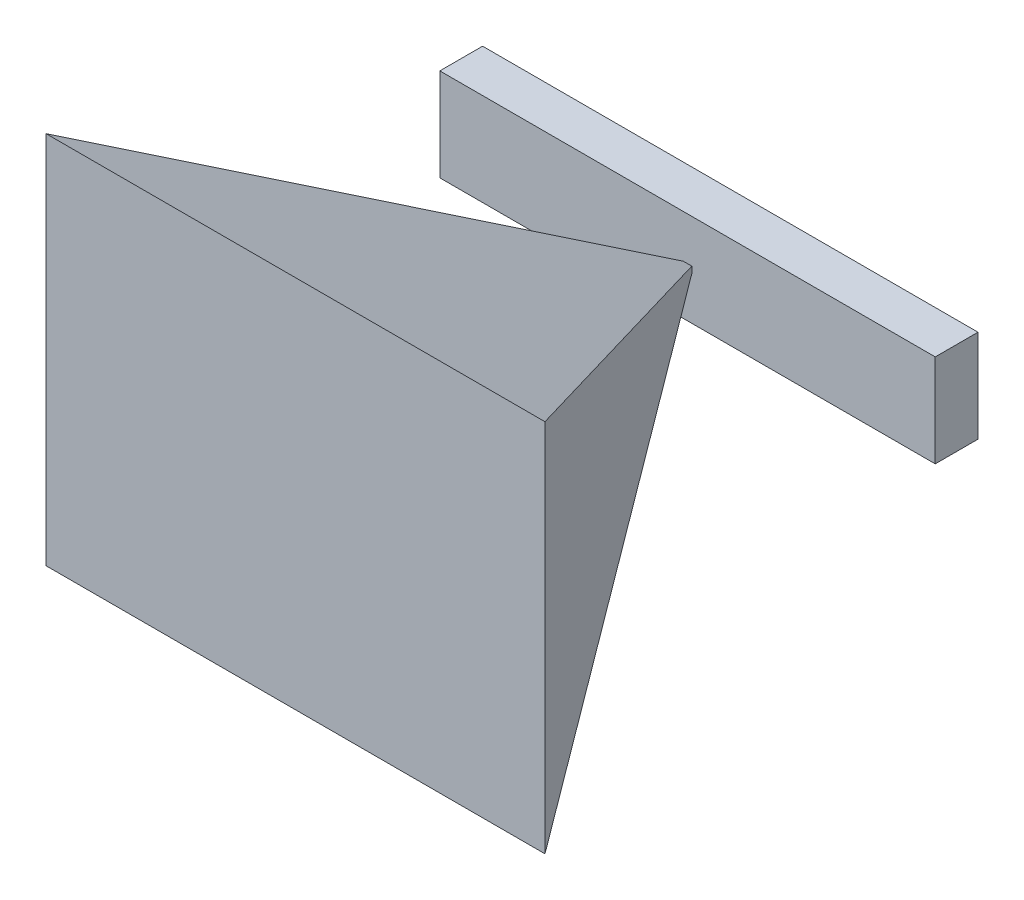
ISO-10303-21;
HEADER;
FILE_DESCRIPTION(('STEP AP214'),'2;1');
FILE_NAME('part.step','',(''),(''),'','','');
FILE_SCHEMA(('AUTOMOTIVE_DESIGN { 1 0 10303 214 1 1 1 1 }'));
ENDSEC;
DATA;
#1=APPLICATION_CONTEXT('core data for automotive mechanical design processes');
#2=APPLICATION_PROTOCOL_DEFINITION('international standard','automotive_design',2000,#1);
#3=PRODUCT_CONTEXT('',#1,'mechanical');
#4=PRODUCT('Part','Part','',(#3));
#5=PRODUCT_RELATED_PRODUCT_CATEGORY('part','',(#4));
#6=PRODUCT_DEFINITION_FORMATION('','',#4);
#7=PRODUCT_DEFINITION_CONTEXT('part definition',#1,'design');
#8=PRODUCT_DEFINITION('design','',#6,#7);
#9=PRODUCT_DEFINITION_SHAPE('','',#8);
#10=(LENGTH_UNIT() NAMED_UNIT(*) SI_UNIT(.MILLI.,.METRE.));
#11=(NAMED_UNIT(*) PLANE_ANGLE_UNIT() SI_UNIT($,.RADIAN.));
#12=(NAMED_UNIT(*) SI_UNIT($,.STERADIAN.) SOLID_ANGLE_UNIT());
#13=UNCERTAINTY_MEASURE_WITH_UNIT(LENGTH_MEASURE(1.E-05),#10,'distance_accuracy_value','');
#14=(GEOMETRIC_REPRESENTATION_CONTEXT(3) GLOBAL_UNCERTAINTY_ASSIGNED_CONTEXT((#13)) GLOBAL_UNIT_ASSIGNED_CONTEXT((#10,
#11,#12)) REPRESENTATION_CONTEXT('',''));
#15=CARTESIAN_POINT('',(0.,0.,0.));
#16=DIRECTION('',(0.,0.,1.));
#17=DIRECTION('',(1.,0.,0.));
#18=AXIS2_PLACEMENT_3D('',#15,#16,#17);
#19=CARTESIAN_POINT('',(0.,0.,122.));
#20=DIRECTION('',(0.,0.,-1.));
#21=DIRECTION('',(-1.,0.,0.));
#22=AXIS2_PLACEMENT_3D('',#19,#20,#21);
#23=PLANE('',#22);
#24=DIRECTION('',(0.,1.,0.));
#25=VECTOR('',#24,1.);
#26=CARTESIAN_POINT('',(70.,-52.5,122.));
#27=LINE('',#26,#25);
#28=CARTESIAN_POINT('',(70.,-52.5,122.));
#29=VERTEX_POINT('',#28);
#30=CARTESIAN_POINT('',(70.,52.5,122.));
#31=VERTEX_POINT('',#30);
#32=EDGE_CURVE('E219',#29,#31,#27,.T.);
#33=ORIENTED_EDGE('',*,*,#32,.T.);
#34=DIRECTION('',(-1.,0.,0.));
#35=VECTOR('',#34,1.);
#36=CARTESIAN_POINT('',(-70.,52.5,122.));
#37=LINE('',#36,#35);
#38=CARTESIAN_POINT('',(-70.,52.5,122.));
#39=VERTEX_POINT('',#38);
#40=EDGE_CURVE('E214',#31,#39,#37,.T.);
#41=ORIENTED_EDGE('',*,*,#40,.T.);
#42=DIRECTION('',(0.,-1.,0.));
#43=VECTOR('',#42,1.);
#44=CARTESIAN_POINT('',(-70.,-52.5,122.));
#45=LINE('',#44,#43);
#46=CARTESIAN_POINT('',(-70.,-52.5,122.));
#47=VERTEX_POINT('',#46);
#48=EDGE_CURVE('E67',#39,#47,#45,.T.);
#49=ORIENTED_EDGE('',*,*,#48,.T.);
#50=DIRECTION('',(1.,0.,0.));
#51=VECTOR('',#50,1.);
#52=CARTESIAN_POINT('',(-70.,-52.5,122.));
#53=LINE('',#52,#51);
#54=EDGE_CURVE('E13',#47,#29,#53,.T.);
#55=ORIENTED_EDGE('',*,*,#54,.T.);
#56=EDGE_LOOP('',(#33,#41,#49,#55));
#57=FACE_BOUND('',#56,.T.);
#58=ADVANCED_FACE('F57',(#57),#23,.F.);
#59=CARTESIAN_POINT('',(0.,0.,12.));
#60=DIRECTION('',(0.,0.,-1.));
#61=DIRECTION('',(-1.,0.,0.));
#62=AXIS2_PLACEMENT_3D('',#59,#60,#61);
#63=PLANE('',#62);
#64=DIRECTION('',(0.,1.,0.));
#65=VECTOR('',#64,1.);
#66=CARTESIAN_POINT('',(1.19999999999999,-0.9,12.));
#67=LINE('',#66,#65);
#68=CARTESIAN_POINT('',(1.19999999999999,-0.9,12.));
#69=VERTEX_POINT('',#68);
#70=CARTESIAN_POINT('',(1.19999999999999,0.899999999999999,12.));
#71=VERTEX_POINT('',#70);
#72=EDGE_CURVE('E125',#69,#71,#67,.T.);
#73=ORIENTED_EDGE('',*,*,#72,.F.);
#74=DIRECTION('',(1.,0.,0.));
#75=VECTOR('',#74,1.);
#76=CARTESIAN_POINT('',(-1.20000000000001,-0.9,12.));
#77=LINE('',#76,#75);
#78=CARTESIAN_POINT('',(-1.20000000000001,-0.9,12.));
#79=VERTEX_POINT('',#78);
#80=EDGE_CURVE('E109',#79,#69,#77,.T.);
#81=ORIENTED_EDGE('',*,*,#80,.F.);
#82=DIRECTION('',(0.,-1.,0.));
#83=VECTOR('',#82,1.);
#84=CARTESIAN_POINT('',(-1.20000000000001,-0.9,12.));
#85=LINE('',#84,#83);
#86=CARTESIAN_POINT('',(-1.20000000000001,0.899999999999999,12.));
#87=VERTEX_POINT('',#86);
#88=EDGE_CURVE('E100',#87,#79,#85,.T.);
#89=ORIENTED_EDGE('',*,*,#88,.F.);
#90=DIRECTION('',(-1.,0.,0.));
#91=VECTOR('',#90,1.);
#92=CARTESIAN_POINT('',(-1.20000000000001,0.899999999999999,12.));
#93=LINE('',#92,#91);
#94=EDGE_CURVE('E105',#71,#87,#93,.T.);
#95=ORIENTED_EDGE('',*,*,#94,.F.);
#96=EDGE_LOOP('',(#73,#81,#89,#95));
#97=FACE_BOUND('',#96,.T.);
#98=ADVANCED_FACE('F104',(#97),#63,.T.);
#99=CARTESIAN_POINT('',(4.53240692336206,0.,2.83481451206645));
#100=DIRECTION('',(0.847825056464727,0.,0.53027603531612));
#101=DIRECTION('',(0.53027603531612,0.,-0.847825056464727));
#102=AXIS2_PLACEMENT_3D('',#99,#100,#101);
#103=PLANE('',#102);
#104=DIRECTION('',(-0.492737573118033,-0.369553179838525,0.787807166322436));
#105=VECTOR('',#104,1.);
#106=CARTESIAN_POINT('',(-1.20000000000001,-0.9,12.));
#107=LINE('',#106,#105);
#108=EDGE_CURVE('E82',#79,#47,#107,.T.);
#109=ORIENTED_EDGE('',*,*,#108,.T.);
#110=ORIENTED_EDGE('',*,*,#48,.F.);
#111=DIRECTION('',(-0.492737573118033,0.369553179838524,0.787807166322436));
#112=VECTOR('',#111,1.);
#113=CARTESIAN_POINT('',(-1.20000000000001,0.899999999999999,12.));
#114=LINE('',#113,#112);
#115=EDGE_CURVE('E121',#87,#39,#114,.T.);
#116=ORIENTED_EDGE('',*,*,#115,.F.);
#117=ORIENTED_EDGE('',*,*,#88,.T.);
#118=EDGE_LOOP('',(#109,#110,#116,#117));
#119=FACE_BOUND('',#118,.T.);
#120=ADVANCED_FACE('F129',(#119),#103,.F.);
#121=CARTESIAN_POINT('',(0.,-3.87615698090304,1.81827000195088));
#122=DIRECTION('',(0.,-0.905340288437873,0.424686898939948));
#123=DIRECTION('',(0.,-0.424686898939948,-0.905340288437873));
#124=AXIS2_PLACEMENT_3D('',#121,#122,#123);
#125=PLANE('',#124);
#126=ORIENTED_EDGE('',*,*,#115,.T.);
#127=ORIENTED_EDGE('',*,*,#40,.F.);
#128=DIRECTION('',(0.492737573118033,0.369553179838524,0.787807166322436));
#129=VECTOR('',#128,1.);
#130=CARTESIAN_POINT('',(1.19999999999999,0.899999999999999,12.));
#131=LINE('',#130,#129);
#132=EDGE_CURVE('E124',#71,#31,#131,.T.);
#133=ORIENTED_EDGE('',*,*,#132,.F.);
#134=ORIENTED_EDGE('',*,*,#94,.T.);
#135=EDGE_LOOP('',(#126,#127,#133,#134));
#136=FACE_BOUND('',#135,.T.);
#137=ADVANCED_FACE('F120',(#136),#125,.F.);
#138=CARTESIAN_POINT('',(0.,3.87615698090304,1.81827000195088));
#139=DIRECTION('',(0.,0.905340288437873,0.424686898939948));
#140=DIRECTION('',(0.,-0.424686898939948,0.905340288437873));
#141=AXIS2_PLACEMENT_3D('',#138,#139,#140);
#142=PLANE('',#141);
#143=DIRECTION('',(0.492737573118033,-0.369553179838525,0.787807166322436));
#144=VECTOR('',#143,1.);
#145=CARTESIAN_POINT('',(1.19999999999999,-0.9,12.));
#146=LINE('',#145,#144);
#147=EDGE_CURVE('E131',#69,#29,#146,.T.);
#148=ORIENTED_EDGE('',*,*,#147,.T.);
#149=ORIENTED_EDGE('',*,*,#54,.F.);
#150=ORIENTED_EDGE('',*,*,#108,.F.);
#151=ORIENTED_EDGE('',*,*,#80,.T.);
#152=EDGE_LOOP('',(#148,#149,#150,#151));
#153=FACE_BOUND('',#152,.T.);
#154=ADVANCED_FACE('F247',(#153),#142,.F.);
#155=CARTESIAN_POINT('',(-4.53240692336207,0.,2.83481451206646));
#156=DIRECTION('',(-0.847825056464727,0.,0.53027603531612));
#157=DIRECTION('',(0.53027603531612,0.,0.847825056464727));
#158=AXIS2_PLACEMENT_3D('',#155,#156,#157);
#159=PLANE('',#158);
#160=ORIENTED_EDGE('',*,*,#132,.T.);
#161=ORIENTED_EDGE('',*,*,#32,.F.);
#162=ORIENTED_EDGE('',*,*,#147,.F.);
#163=ORIENTED_EDGE('',*,*,#72,.T.);
#164=EDGE_LOOP('',(#160,#161,#162,#163));
#165=FACE_BOUND('',#164,.T.);
#166=ADVANCED_FACE('F239',(#165),#159,.F.);
#167=CLOSED_SHELL('',(#58,#98,#120,#137,#154,#166));
#168=MANIFOLD_SOLID_BREP('B2_NOT_SHOWN',#167);
#169=CARTESIAN_POINT('',(69.5,-13.,12.));
#170=DIRECTION('',(-1.,0.,0.));
#171=DIRECTION('',(0.,0.,1.));
#172=AXIS2_PLACEMENT_3D('',#169,#170,#171);
#173=PLANE('',#172);
#174=DIRECTION('',(0.,1.,0.));
#175=VECTOR('',#174,1.);
#176=CARTESIAN_POINT('',(69.5,-13.,0.));
#177=LINE('',#176,#175);
#178=CARTESIAN_POINT('',(69.5,-13.,0.));
#179=VERTEX_POINT('',#178);
#180=CARTESIAN_POINT('',(69.5,13.,0.));
#181=VERTEX_POINT('',#180);
#182=EDGE_CURVE('E429',#179,#181,#177,.T.);
#183=ORIENTED_EDGE('',*,*,#182,.T.);
#184=DIRECTION('',(0.,0.,-1.));
#185=VECTOR('',#184,1.);
#186=CARTESIAN_POINT('',(69.5,13.,12.));
#187=LINE('',#186,#185);
#188=CARTESIAN_POINT('',(69.5,13.,12.));
#189=VERTEX_POINT('',#188);
#190=EDGE_CURVE('E55',#189,#181,#187,.T.);
#191=ORIENTED_EDGE('',*,*,#190,.F.);
#192=DIRECTION('',(0.,1.,0.));
#193=VECTOR('',#192,1.);
#194=CARTESIAN_POINT('',(69.5,-13.,12.));
#195=LINE('',#194,#193);
#196=CARTESIAN_POINT('',(69.5,-13.,12.));
#197=VERTEX_POINT('',#196);
#198=EDGE_CURVE('E417',#197,#189,#195,.T.);
#199=ORIENTED_EDGE('',*,*,#198,.F.);
#200=DIRECTION('',(0.,0.,-1.));
#201=VECTOR('',#200,1.);
#202=CARTESIAN_POINT('',(69.5,-13.,12.));
#203=LINE('',#202,#201);
#204=EDGE_CURVE('E425',#197,#179,#203,.T.);
#205=ORIENTED_EDGE('',*,*,#204,.T.);
#206=EDGE_LOOP('',(#183,#191,#199,#205));
#207=FACE_BOUND('',#206,.T.);
#208=ADVANCED_FACE('F366',(#207),#173,.F.);
#209=CARTESIAN_POINT('',(-69.5,13.,12.));
#210=DIRECTION('',(0.,-1.,0.));
#211=DIRECTION('',(0.,0.,-1.));
#212=AXIS2_PLACEMENT_3D('',#209,#210,#211);
#213=PLANE('',#212);
#214=DIRECTION('',(-1.,0.,0.));
#215=VECTOR('',#214,1.);
#216=CARTESIAN_POINT('',(-69.5,13.,0.));
#217=LINE('',#216,#215);
#218=CARTESIAN_POINT('',(-69.5,13.,0.));
#219=VERTEX_POINT('',#218);
#220=EDGE_CURVE('E421',#181,#219,#217,.T.);
#221=ORIENTED_EDGE('',*,*,#220,.T.);
#222=DIRECTION('',(0.,0.,-1.));
#223=VECTOR('',#222,1.);
#224=CARTESIAN_POINT('',(-69.5,13.,12.));
#225=LINE('',#224,#223);
#226=CARTESIAN_POINT('',(-69.5,13.,12.));
#227=VERTEX_POINT('',#226);
#228=EDGE_CURVE('E374',#227,#219,#225,.T.);
#229=ORIENTED_EDGE('',*,*,#228,.F.);
#230=DIRECTION('',(-1.,0.,0.));
#231=VECTOR('',#230,1.);
#232=CARTESIAN_POINT('',(-69.5,13.,12.));
#233=LINE('',#232,#231);
#234=EDGE_CURVE('E412',#189,#227,#233,.T.);
#235=ORIENTED_EDGE('',*,*,#234,.F.);
#236=ORIENTED_EDGE('',*,*,#190,.T.);
#237=EDGE_LOOP('',(#221,#229,#235,#236));
#238=FACE_BOUND('',#237,.T.);
#239=ADVANCED_FACE('F420',(#238),#213,.F.);
#240=CARTESIAN_POINT('',(-69.5,-13.,12.));
#241=DIRECTION('',(1.,0.,0.));
#242=DIRECTION('',(0.,0.,-1.));
#243=AXIS2_PLACEMENT_3D('',#240,#241,#242);
#244=PLANE('',#243);
#245=DIRECTION('',(0.,-1.,0.));
#246=VECTOR('',#245,1.);
#247=CARTESIAN_POINT('',(-69.5,-13.,0.));
#248=LINE('',#247,#246);
#249=CARTESIAN_POINT('',(-69.5,-13.,0.));
#250=VERTEX_POINT('',#249);
#251=EDGE_CURVE('E399',#219,#250,#248,.T.);
#252=ORIENTED_EDGE('',*,*,#251,.T.);
#253=DIRECTION('',(0.,0.,-1.));
#254=VECTOR('',#253,1.);
#255=CARTESIAN_POINT('',(-69.5,-13.,12.));
#256=LINE('',#255,#254);
#257=CARTESIAN_POINT('',(-69.5,-13.,12.));
#258=VERTEX_POINT('',#257);
#259=EDGE_CURVE('E422',#258,#250,#256,.T.);
#260=ORIENTED_EDGE('',*,*,#259,.F.);
#261=DIRECTION('',(0.,-1.,0.));
#262=VECTOR('',#261,1.);
#263=CARTESIAN_POINT('',(-69.5,-13.,12.));
#264=LINE('',#263,#262);
#265=EDGE_CURVE('E415',#227,#258,#264,.T.);
#266=ORIENTED_EDGE('',*,*,#265,.F.);
#267=ORIENTED_EDGE('',*,*,#228,.T.);
#268=EDGE_LOOP('',(#252,#260,#266,#267));
#269=FACE_BOUND('',#268,.T.);
#270=ADVANCED_FACE('F423',(#269),#244,.F.);
#271=CARTESIAN_POINT('',(-69.5,-13.,12.));
#272=DIRECTION('',(0.,1.,0.));
#273=DIRECTION('',(0.,0.,1.));
#274=AXIS2_PLACEMENT_3D('',#271,#272,#273);
#275=PLANE('',#274);
#276=DIRECTION('',(1.,0.,0.));
#277=VECTOR('',#276,1.);
#278=CARTESIAN_POINT('',(-69.5,-13.,0.));
#279=LINE('',#278,#277);
#280=EDGE_CURVE('E405',#250,#179,#279,.T.);
#281=ORIENTED_EDGE('',*,*,#280,.T.);
#282=ORIENTED_EDGE('',*,*,#204,.F.);
#283=DIRECTION('',(1.,0.,0.));
#284=VECTOR('',#283,1.);
#285=CARTESIAN_POINT('',(-69.5,-13.,12.));
#286=LINE('',#285,#284);
#287=EDGE_CURVE('E382',#258,#197,#286,.T.);
#288=ORIENTED_EDGE('',*,*,#287,.F.);
#289=ORIENTED_EDGE('',*,*,#259,.T.);
#290=EDGE_LOOP('',(#281,#282,#288,#289));
#291=FACE_BOUND('',#290,.T.);
#292=ADVANCED_FACE('F437',(#291),#275,.F.);
#293=CARTESIAN_POINT('',(0.,0.,12.));
#294=DIRECTION('',(0.,0.,-1.));
#295=DIRECTION('',(-1.,0.,0.));
#296=AXIS2_PLACEMENT_3D('',#293,#294,#295);
#297=PLANE('',#296);
#298=ORIENTED_EDGE('',*,*,#198,.T.);
#299=ORIENTED_EDGE('',*,*,#234,.T.);
#300=ORIENTED_EDGE('',*,*,#265,.T.);
#301=ORIENTED_EDGE('',*,*,#287,.T.);
#302=EDGE_LOOP('',(#298,#299,#300,#301));
#303=FACE_BOUND('',#302,.T.);
#304=ADVANCED_FACE('F413',(#303),#297,.F.);
#305=CARTESIAN_POINT('',(0.,0.,0.));
#306=DIRECTION('',(0.,0.,-1.));
#307=DIRECTION('',(-1.,0.,0.));
#308=AXIS2_PLACEMENT_3D('',#305,#306,#307);
#309=PLANE('',#308);
#310=CARTESIAN_POINT('',(25.,0.,0.));
#311=DIRECTION('',(0.,0.,-1.));
#312=DIRECTION('',(-1.,0.,0.));
#313=AXIS2_PLACEMENT_3D('',#310,#311,#312);
#314=CIRCLE('',#313,1.2);
#315=CARTESIAN_POINT('',(23.8,0.,0.));
#316=VERTEX_POINT('',#315);
#317=EDGE_CURVE('E449',#316,#316,#314,.T.);
#318=ORIENTED_EDGE('',*,*,#317,.F.);
#319=EDGE_LOOP('',(#318));
#320=FACE_BOUND('',#319,.T.);
#321=CARTESIAN_POINT('',(-25.,0.,0.));
#322=DIRECTION('',(0.,0.,-1.));
#323=DIRECTION('',(1.,0.,0.));
#324=AXIS2_PLACEMENT_3D('',#321,#322,#323);
#325=CIRCLE('',#324,1.2);
#326=CARTESIAN_POINT('',(-23.8,0.,0.));
#327=VERTEX_POINT('',#326);
#328=EDGE_CURVE('E443',#327,#327,#325,.T.);
#329=ORIENTED_EDGE('',*,*,#328,.F.);
#330=EDGE_LOOP('',(#329));
#331=FACE_BOUND('',#330,.T.);
#332=ORIENTED_EDGE('',*,*,#182,.F.);
#333=ORIENTED_EDGE('',*,*,#280,.F.);
#334=ORIENTED_EDGE('',*,*,#251,.F.);
#335=ORIENTED_EDGE('',*,*,#220,.F.);
#336=EDGE_LOOP('',(#332,#333,#334,#335));
#337=FACE_BOUND('',#336,.T.);
#338=ADVANCED_FACE('F440',(#320,#331,#337),#309,.T.);
#339=CARTESIAN_POINT('',(-25.,0.,5.));
#340=DIRECTION('',(0.,0.,-1.));
#341=DIRECTION('',(-1.,0.,0.));
#342=AXIS2_PLACEMENT_3D('',#339,#340,#341);
#343=CYLINDRICAL_SURFACE('',#342,1.2);
#344=CARTESIAN_POINT('',(-25.,0.,5.));
#345=DIRECTION('',(0.,0.,-1.));
#346=DIRECTION('',(1.,0.,0.));
#347=AXIS2_PLACEMENT_3D('',#344,#345,#346);
#348=CIRCLE('',#347,1.2);
#349=CARTESIAN_POINT('',(-23.8,0.,5.));
#350=VERTEX_POINT('',#349);
#351=EDGE_CURVE('E446',#350,#350,#348,.T.);
#352=ORIENTED_EDGE('',*,*,#351,.F.);
#353=EDGE_LOOP('',(#352));
#354=FACE_BOUND('',#353,.T.);
#355=ORIENTED_EDGE('',*,*,#328,.T.);
#356=EDGE_LOOP('',(#355));
#357=FACE_BOUND('',#356,.T.);
#358=ADVANCED_FACE('F466',(#354,#357),#343,.F.);
#359=CARTESIAN_POINT('',(-25.,0.,5.));
#360=DIRECTION('',(0.,0.,1.));
#361=DIRECTION('',(1.,0.,0.));
#362=AXIS2_PLACEMENT_3D('',#359,#360,#361);
#363=PLANE('',#362);
#364=ORIENTED_EDGE('',*,*,#351,.T.);
#365=EDGE_LOOP('',(#364));
#366=FACE_BOUND('',#365,.T.);
#367=ADVANCED_FACE('F460',(#366),#363,.F.);
#368=CARTESIAN_POINT('',(25.,0.,5.));
#369=DIRECTION('',(0.,0.,-1.));
#370=DIRECTION('',(-1.,0.,0.));
#371=AXIS2_PLACEMENT_3D('',#368,#369,#370);
#372=CYLINDRICAL_SURFACE('',#371,1.2);
#373=CARTESIAN_POINT('',(25.,0.,5.));
#374=DIRECTION('',(0.,0.,-1.));
#375=DIRECTION('',(-1.,0.,0.));
#376=AXIS2_PLACEMENT_3D('',#373,#374,#375);
#377=CIRCLE('',#376,1.2);
#378=CARTESIAN_POINT('',(23.8,0.,5.));
#379=VERTEX_POINT('',#378);
#380=EDGE_CURVE('E432',#379,#379,#377,.T.);
#381=ORIENTED_EDGE('',*,*,#380,.F.);
#382=EDGE_LOOP('',(#381));
#383=FACE_BOUND('',#382,.T.);
#384=ORIENTED_EDGE('',*,*,#317,.T.);
#385=EDGE_LOOP('',(#384));
#386=FACE_BOUND('',#385,.T.);
#387=ADVANCED_FACE('F457',(#383,#386),#372,.F.);
#388=CARTESIAN_POINT('',(25.,0.,5.));
#389=DIRECTION('',(0.,0.,-1.));
#390=DIRECTION('',(-1.,0.,0.));
#391=AXIS2_PLACEMENT_3D('',#388,#389,#390);
#392=PLANE('',#391);
#393=ORIENTED_EDGE('',*,*,#380,.T.);
#394=EDGE_LOOP('',(#393));
#395=FACE_BOUND('',#394,.T.);
#396=ADVANCED_FACE('F455',(#395),#392,.T.);
#397=CLOSED_SHELL('',(#208,#239,#270,#292,#304,#338,#358,#367,#387,#396));
#398=MANIFOLD_SOLID_BREP('B7',#397);
#399=ADVANCED_BREP_SHAPE_REPRESENTATION('',(#18,#168,#398),#14);
#400=SHAPE_DEFINITION_REPRESENTATION(#9,#399);
ENDSEC;
END-ISO-10303-21;
